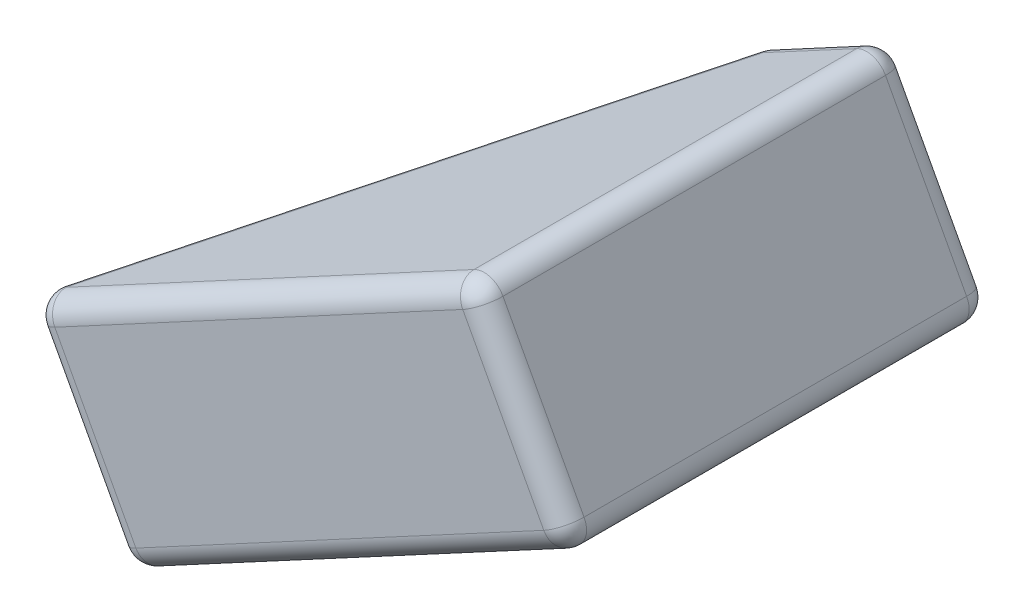
ISO-10303-21;
HEADER;
FILE_DESCRIPTION(('STEP AP214'),'2;1');
FILE_NAME('part.step','',(''),(''),'','','');
FILE_SCHEMA(('AUTOMOTIVE_DESIGN { 1 0 10303 214 1 1 1 1 }'));
ENDSEC;
DATA;
#1=APPLICATION_CONTEXT('core data for automotive mechanical design processes');
#2=APPLICATION_PROTOCOL_DEFINITION('international standard','automotive_design',2000,#1);
#3=PRODUCT_CONTEXT('',#1,'mechanical');
#4=PRODUCT('Part','Part','',(#3));
#5=PRODUCT_RELATED_PRODUCT_CATEGORY('part','',(#4));
#6=PRODUCT_DEFINITION_FORMATION('','',#4);
#7=PRODUCT_DEFINITION_CONTEXT('part definition',#1,'design');
#8=PRODUCT_DEFINITION('design','',#6,#7);
#9=PRODUCT_DEFINITION_SHAPE('','',#8);
#10=(LENGTH_UNIT() NAMED_UNIT(*) SI_UNIT(.MILLI.,.METRE.));
#11=(NAMED_UNIT(*) PLANE_ANGLE_UNIT() SI_UNIT($,.RADIAN.));
#12=(NAMED_UNIT(*) SI_UNIT($,.STERADIAN.) SOLID_ANGLE_UNIT());
#13=UNCERTAINTY_MEASURE_WITH_UNIT(LENGTH_MEASURE(1.E-05),#10,'distance_accuracy_value','');
#14=(GEOMETRIC_REPRESENTATION_CONTEXT(3) GLOBAL_UNCERTAINTY_ASSIGNED_CONTEXT((#13)) GLOBAL_UNIT_ASSIGNED_CONTEXT((#10,
#11,#12)) REPRESENTATION_CONTEXT('',''));
#15=CARTESIAN_POINT('',(0.,0.,0.));
#16=DIRECTION('',(0.,0.,1.));
#17=DIRECTION('',(1.,0.,0.));
#18=AXIS2_PLACEMENT_3D('',#15,#16,#17);
#19=CARTESIAN_POINT('',(-112.546868697293,182.325932093575,0.));
#20=DIRECTION('',(-0.88073389674916,-0.473611447409203,0.));
#21=DIRECTION('',(0.473611447409203,-0.88073389674916,0.));
#22=AXIS2_PLACEMENT_3D('',#19,#20,#21);
#23=PLANE('',#22);
#24=DIRECTION('',(0.,0.,1.));
#25=VECTOR('',#24,1.);
#26=CARTESIAN_POINT('',(-114.952814850132,186.800060289061,0.));
#27=LINE('',#26,#25);
#28=CARTESIAN_POINT('',(-114.952814850132,186.800060289061,736.2825));
#29=VERTEX_POINT('',#28);
#30=CARTESIAN_POINT('',(-114.952814850132,186.800060289061,645.455537260085));
#31=VERTEX_POINT('',#30);
#32=EDGE_CURVE('E159',#29,#31,#27,.F.);
#33=ORIENTED_EDGE('',*,*,#32,.T.);
#34=DIRECTION('',(-0.473611447409203,0.88073389674916,0.));
#35=VECTOR('',#34,1.);
#36=CARTESIAN_POINT('',(-136.60633022568,227.067214048432,645.455537260085));
#37=LINE('',#36,#35);
#38=CARTESIAN_POINT('',(-134.200384072842,222.593085852946,645.455537260085));
#39=VERTEX_POINT('',#38);
#40=EDGE_CURVE('E162',#31,#39,#37,.T.);
#41=ORIENTED_EDGE('',*,*,#40,.T.);
#42=DIRECTION('',(0.,0.,1.));
#43=VECTOR('',#42,1.);
#44=CARTESIAN_POINT('',(-134.200384072842,222.593085852946,741.3625));
#45=LINE('',#44,#43);
#46=CARTESIAN_POINT('',(-134.200384072842,222.593085852946,736.2825));
#47=VERTEX_POINT('',#46);
#48=EDGE_CURVE('E135',#39,#47,#45,.T.);
#49=ORIENTED_EDGE('',*,*,#48,.T.);
#50=DIRECTION('',(-0.473611447409203,0.88073389674916,0.));
#51=VECTOR('',#50,1.);
#52=CARTESIAN_POINT('',(-112.546868697293,182.325932093575,736.2825));
#53=LINE('',#52,#51);
#54=EDGE_CURVE('E153',#47,#29,#53,.F.);
#55=ORIENTED_EDGE('',*,*,#54,.T.);
#56=EDGE_LOOP('',(#33,#41,#49,#55));
#57=FACE_BOUND('',#56,.T.);
#58=ADVANCED_FACE('F41',(#57),#23,.F.);
#59=CARTESIAN_POINT('',(-101.297964826565,188.374989207928,741.3625));
#60=DIRECTION('',(0.,0.,-1.));
#61=DIRECTION('',(-1.,0.,0.));
#62=AXIS2_PLACEMENT_3D('',#59,#60,#61);
#63=PLANE('',#62);
#64=DIRECTION('',(-0.88073389674916,-0.473611447409203,0.));
#65=VECTOR('',#64,1.);
#66=CARTESIAN_POINT('',(-245.820166389185,162.569954169847,741.3625));
#67=LINE('',#66,#65);
#68=CARTESIAN_POINT('',(-138.674512268327,220.187139700108,741.3625));
#69=VERTEX_POINT('',#68);
#70=CARTESIAN_POINT('',(-235.529606277727,168.103665415694,741.3625));
#71=VERTEX_POINT('',#70);
#72=EDGE_CURVE('E197',#69,#71,#67,.T.);
#73=ORIENTED_EDGE('',*,*,#72,.T.);
#74=DIRECTION('',(-0.473611447409203,0.88073389674916,0.));
#75=VECTOR('',#74,1.);
#76=CARTESIAN_POINT('',(-213.876090902179,127.836511656322,741.3625));
#77=LINE('',#76,#75);
#78=CARTESIAN_POINT('',(-216.282037055017,132.310639851808,741.3625));
#79=VERTEX_POINT('',#78);
#80=EDGE_CURVE('E200',#71,#79,#77,.F.);
#81=ORIENTED_EDGE('',*,*,#80,.T.);
#82=DIRECTION('',(-0.88073389674916,-0.473611447409203,0.));
#83=VECTOR('',#82,1.);
#84=CARTESIAN_POINT('',(-103.703910979404,192.849117403414,741.3625));
#85=LINE('',#84,#83);
#86=CARTESIAN_POINT('',(-119.426943045617,184.394114136222,741.3625));
#87=VERTEX_POINT('',#86);
#88=EDGE_CURVE('E195',#79,#87,#85,.F.);
#89=ORIENTED_EDGE('',*,*,#88,.T.);
#90=DIRECTION('',(-0.473611447409203,0.88073389674916,0.));
#91=VECTOR('',#90,1.);
#92=CARTESIAN_POINT('',(-117.020996892779,179.919985940736,741.3625));
#93=LINE('',#92,#91);
#94=EDGE_CURVE('E193',#87,#69,#93,.T.);
#95=ORIENTED_EDGE('',*,*,#94,.T.);
#96=EDGE_LOOP('',(#73,#81,#89,#95));
#97=FACE_BOUND('',#96,.T.);
#98=ADVANCED_FACE('F330',(#97),#63,.F.);
#99=CARTESIAN_POINT('',(158.667717373974,328.170588625835,275.280094349453));
#100=DIRECTION('',(-0.644095135315765,-0.34635981473188,-0.682038367983403));
#101=DIRECTION('',(-0.727040935214636,0.,0.686594114832211));
#102=AXIS2_PLACEMENT_3D('',#99,#100,#101);
#103=PLANE('',#102);
#104=DIRECTION('',(-0.60069430956646,-0.323021178649231,0.73131639158338));
#105=VECTOR('',#104,1.);
#106=CARTESIAN_POINT('',(137.014201998425,368.437742385207,275.280094349453));
#107=LINE('',#106,#105);
#108=CARTESIAN_POINT('',(-238.801609565132,166.344157556856,732.817745090644));
#109=VERTEX_POINT('',#108);
#110=CARTESIAN_POINT('',(-164.197456969912,206.462269081547,641.99078235073));
#111=VERTEX_POINT('',#110);
#112=EDGE_CURVE('E188',#109,#111,#107,.F.);
#113=ORIENTED_EDGE('',*,*,#112,.T.);
#114=DIRECTION('',(-0.473611447409203,0.88073389674916,0.));
#115=VECTOR('',#114,1.);
#116=CARTESIAN_POINT('',(-142.543941594364,166.195115322176,641.99078235073));
#117=LINE('',#116,#115);
#118=CARTESIAN_POINT('',(-144.949887747202,170.669243517661,641.99078235073));
#119=VERTEX_POINT('',#118);
#120=EDGE_CURVE('E191',#111,#119,#117,.F.);
#121=ORIENTED_EDGE('',*,*,#120,.T.);
#122=DIRECTION('',(-0.60069430956646,-0.323021178649231,0.73131639158338));
#123=VECTOR('',#122,1.);
#124=CARTESIAN_POINT('',(-226.572597166475,126.776928605961,741.3625));
#125=LINE('',#124,#123);
#126=CARTESIAN_POINT('',(-219.554040342421,130.55113199297,732.817745090644));
#127=VERTEX_POINT('',#126);
#128=EDGE_CURVE('E186',#119,#127,#125,.T.);
#129=ORIENTED_EDGE('',*,*,#128,.T.);
#130=DIRECTION('',(-0.473611447409203,0.88073389674916,0.));
#131=VECTOR('',#130,1.);
#132=CARTESIAN_POINT('',(-241.20755571797,170.818285752342,732.817745090644));
#133=LINE('',#132,#131);
#134=EDGE_CURVE('E184',#127,#109,#133,.T.);
#135=ORIENTED_EDGE('',*,*,#134,.T.);
#136=EDGE_LOOP('',(#113,#121,#129,#135));
#137=FACE_BOUND('',#136,.T.);
#138=ADVANCED_FACE('F301',(#137),#103,.T.);
#139=CARTESIAN_POINT('',(-101.297964826565,188.374989207928,640.375537260085));
#140=DIRECTION('',(0.,0.,-1.));
#141=DIRECTION('',(-1.,0.,0.));
#142=AXIS2_PLACEMENT_3D('',#139,#140,#141);
#143=PLANE('',#142);
#144=DIRECTION('',(-0.88073389674916,-0.473611447409203,0.));
#145=VECTOR('',#144,1.);
#146=CARTESIAN_POINT('',(-122.951480202114,228.642142967299,640.375537260085));
#147=LINE('',#146,#145);
#148=CARTESIAN_POINT('',(-160.925453682508,208.221776940385,640.375537260085));
#149=VERTEX_POINT('',#148);
#150=CARTESIAN_POINT('',(-138.674512268327,220.187139700108,640.375537260085));
#151=VERTEX_POINT('',#150);
#152=EDGE_CURVE('E179',#149,#151,#147,.F.);
#153=ORIENTED_EDGE('',*,*,#152,.T.);
#154=DIRECTION('',(-0.473611447409203,0.88073389674916,0.));
#155=VECTOR('',#154,1.);
#156=CARTESIAN_POINT('',(-117.020996892779,179.919985940736,640.375537260085));
#157=LINE('',#156,#155);
#158=CARTESIAN_POINT('',(-119.426943045617,184.394114136222,640.375537260085));
#159=VERTEX_POINT('',#158);
#160=EDGE_CURVE('E182',#151,#159,#157,.F.);
#161=ORIENTED_EDGE('',*,*,#160,.T.);
#162=DIRECTION('',(-0.88073389674916,-0.473611447409203,0.));
#163=VECTOR('',#162,1.);
#164=CARTESIAN_POINT('',(-143.623145251517,171.382694465831,640.375537260085));
#165=LINE('',#164,#163);
#166=CARTESIAN_POINT('',(-141.677884459798,172.428751376499,640.375537260085));
#167=VERTEX_POINT('',#166);
#168=EDGE_CURVE('E177',#159,#167,#165,.T.);
#169=ORIENTED_EDGE('',*,*,#168,.T.);
#170=DIRECTION('',(-0.473611447409203,0.88073389674916,0.));
#171=VECTOR('',#170,1.);
#172=CARTESIAN_POINT('',(-139.271938306959,167.954623181014,640.375537260085));
#173=LINE('',#172,#171);
#174=EDGE_CURVE('E175',#167,#149,#173,.T.);
#175=ORIENTED_EDGE('',*,*,#174,.T.);
#176=EDGE_LOOP('',(#153,#161,#169,#175));
#177=FACE_BOUND('',#176,.T.);
#178=ADVANCED_FACE('F274',(#177),#143,.T.);
#179=CARTESIAN_POINT('',(-101.297964826565,188.374989207928,0.));
#180=DIRECTION('',(-0.473611447409203,0.88073389674916,0.));
#181=DIRECTION('',(-0.88073389674916,-0.473611447409203,0.));
#182=AXIS2_PLACEMENT_3D('',#179,#180,#181);
#183=PLANE('',#182);
#184=DIRECTION('',(-0.88073389674916,-0.473611447409203,0.));
#185=VECTOR('',#184,1.);
#186=CARTESIAN_POINT('',(-112.546868697293,182.325932093575,645.455537260085));
#187=LINE('',#186,#185);
#188=CARTESIAN_POINT('',(-139.271938306959,167.954623181014,645.455537260085));
#189=VERTEX_POINT('',#188);
#190=CARTESIAN_POINT('',(-117.020996892779,179.919985940736,645.455537260085));
#191=VERTEX_POINT('',#190);
#192=EDGE_CURVE('E50',#189,#191,#187,.F.);
#193=ORIENTED_EDGE('',*,*,#192,.T.);
#194=DIRECTION('',(0.,0.,1.));
#195=VECTOR('',#194,1.);
#196=CARTESIAN_POINT('',(-117.020996892779,179.919985940736,0.));
#197=LINE('',#196,#195);
#198=CARTESIAN_POINT('',(-117.020996892779,179.919985940736,736.2825));
#199=VERTEX_POINT('',#198);
#200=EDGE_CURVE('E11',#191,#199,#197,.T.);
#201=ORIENTED_EDGE('',*,*,#200,.T.);
#202=DIRECTION('',(-0.88073389674916,-0.473611447409203,0.));
#203=VECTOR('',#202,1.);
#204=CARTESIAN_POINT('',(-101.297964826565,188.374989207928,736.2825));
#205=LINE('',#204,#203);
#206=CARTESIAN_POINT('',(-213.876090902179,127.836511656322,736.2825));
#207=VERTEX_POINT('',#206);
#208=EDGE_CURVE('E202',#199,#207,#205,.T.);
#209=ORIENTED_EDGE('',*,*,#208,.T.);
#210=DIRECTION('',(-0.60069430956646,-0.323021178649231,0.73131639158338));
#211=VECTOR('',#210,1.);
#212=CARTESIAN_POINT('',(-137.945195811274,168.668074129184,643.840292169441));
#213=LINE('',#212,#211);
#214=EDGE_CURVE('E61',#207,#189,#213,.F.);
#215=ORIENTED_EDGE('',*,*,#214,.T.);
#216=EDGE_LOOP('',(#193,#201,#209,#215));
#217=FACE_BOUND('',#216,.T.);
#218=ADVANCED_FACE('F289',(#217),#183,.F.);
#219=CARTESIAN_POINT('',(-125.357426354952,233.116271162785,0.));
#220=DIRECTION('',(-0.473611447409203,0.88073389674916,0.));
#221=DIRECTION('',(-0.88073389674916,-0.473611447409203,0.));
#222=AXIS2_PLACEMENT_3D('',#219,#220,#221);
#223=PLANE('',#222);
#224=DIRECTION('',(-0.88073389674916,-0.473611447409203,0.));
#225=VECTOR('',#224,1.);
#226=CARTESIAN_POINT('',(-136.60633022568,227.067214048432,736.2825));
#227=LINE('',#226,#225);
#228=CARTESIAN_POINT('',(-237.935552430566,172.57779361118,736.2825));
#229=VERTEX_POINT('',#228);
#230=CARTESIAN_POINT('',(-141.080458421166,224.661267895593,736.2825));
#231=VERTEX_POINT('',#230);
#232=EDGE_CURVE('E165',#229,#231,#227,.F.);
#233=ORIENTED_EDGE('',*,*,#232,.T.);
#234=DIRECTION('',(0.,0.,1.));
#235=VECTOR('',#234,1.);
#236=CARTESIAN_POINT('',(-141.080458421166,224.661267895593,640.375537260085));
#237=LINE('',#236,#235);
#238=CARTESIAN_POINT('',(-141.080458421166,224.661267895593,645.455537260085));
#239=VERTEX_POINT('',#238);
#240=EDGE_CURVE('E137',#231,#239,#237,.F.);
#241=ORIENTED_EDGE('',*,*,#240,.T.);
#242=DIRECTION('',(-0.88073389674916,-0.473611447409203,0.));
#243=VECTOR('',#242,1.);
#244=CARTESIAN_POINT('',(-125.357426354952,233.116271162785,645.455537260085));
#245=LINE('',#244,#243);
#246=CARTESIAN_POINT('',(-163.331399835347,212.695905135871,645.455537260085));
#247=VERTEX_POINT('',#246);
#248=EDGE_CURVE('E172',#239,#247,#245,.T.);
#249=ORIENTED_EDGE('',*,*,#248,.T.);
#250=DIRECTION('',(-0.60069430956646,-0.323021178649231,0.73131639158338));
#251=VECTOR('',#250,1.);
#252=CARTESIAN_POINT('',(137.880259132991,374.671378439531,278.744849258809));
#253=LINE('',#252,#251);
#254=EDGE_CURVE('E170',#247,#229,#253,.T.);
#255=ORIENTED_EDGE('',*,*,#254,.T.);
#256=EDGE_LOOP('',(#233,#241,#249,#255));
#257=FACE_BOUND('',#256,.T.);
#258=ADVANCED_FACE('F492',(#257),#223,.T.);
#259=CARTESIAN_POINT('',(159.533774508539,334.404224680159,278.744849258809));
#260=DIRECTION('',(0.60069430956646,0.323021178649231,-0.73131639158338));
#261=DIRECTION('',(-0.772741734414245,0.,-0.634720577809216));
#262=AXIS2_PLACEMENT_3D('',#259,#260,#261);
#263=CYLINDRICAL_SURFACE('',#262,5.08);
#264=CARTESIAN_POINT('',(-141.677884459798,172.428751376499,645.455537260085));
#265=DIRECTION('',(0.600694309566454,0.323021178649229,-0.731316391583386));
#266=DIRECTION('',(-0.77274173441425,0.,-0.634720577809209));
#267=AXIS2_PLACEMENT_3D('',#264,#265,#266);
#268=CIRCLE('',#267,5.08);
#269=EDGE_CURVE('E45',#189,#119,#268,.T.);
#270=ORIENTED_EDGE('',*,*,#269,.F.);
#271=ORIENTED_EDGE('',*,*,#214,.F.);
#272=CARTESIAN_POINT('',(-216.282037055017,132.310639851808,736.2825));
#273=DIRECTION('',(-0.600694309566459,-0.323021178649236,0.731316391583379));
#274=DIRECTION('',(0.772741734414245,0.,0.634720577809215));
#275=AXIS2_PLACEMENT_3D('',#272,#273,#274);
#276=CIRCLE('',#275,5.08);
#277=EDGE_CURVE('E254',#127,#207,#276,.T.);
#278=ORIENTED_EDGE('',*,*,#277,.F.);
#279=ORIENTED_EDGE('',*,*,#128,.F.);
#280=EDGE_LOOP('',(#270,#271,#278,#279));
#281=FACE_BOUND('',#280,.T.);
#282=ADVANCED_FACE('F43',(#281),#263,.T.);
#283=CARTESIAN_POINT('',(-141.677884459798,172.428751376499,645.455537260085));
#284=DIRECTION('',(0.473611447409218,-0.880733896749152,0.));
#285=DIRECTION('',(0.880733896749152,0.473611447409218,0.));
#286=AXIS2_PLACEMENT_3D('',#283,#284,#285);
#287=SPHERICAL_SURFACE('',#286,5.08);
#288=CARTESIAN_POINT('',(-141.677884459798,172.428751376499,645.455537260085));
#289=DIRECTION('',(-0.88073389674915,-0.473611447409222,0.));
#290=DIRECTION('',(0.473611447409222,-0.88073389674915,0.));
#291=AXIS2_PLACEMENT_3D('',#288,#289,#290);
#292=CIRCLE('',#291,5.08);
#293=EDGE_CURVE('E249',#189,#167,#292,.F.);
#294=ORIENTED_EDGE('',*,*,#293,.F.);
#295=ORIENTED_EDGE('',*,*,#269,.T.);
#296=CARTESIAN_POINT('',(-141.677884459798,172.428751376499,645.455537260085));
#297=DIRECTION('',(0.473611447409199,-0.880733896749162,0.));
#298=DIRECTION('',(0.880733896749162,0.473611447409199,0.));
#299=AXIS2_PLACEMENT_3D('',#296,#297,#298);
#300=CIRCLE('',#299,5.08);
#301=EDGE_CURVE('E252',#167,#119,#300,.F.);
#302=ORIENTED_EDGE('',*,*,#301,.F.);
#303=EDGE_LOOP('',(#294,#295,#302));
#304=FACE_BOUND('',#303,.T.);
#305=ADVANCED_FACE('F264',(#304),#287,.T.);
#306=CARTESIAN_POINT('',(-216.282037055017,132.310639851808,736.2825));
#307=DIRECTION('',(0.473611447409232,-0.880733896749144,0.));
#308=DIRECTION('',(0.880733896749144,0.473611447409233,0.));
#309=AXIS2_PLACEMENT_3D('',#306,#307,#308);
#310=SPHERICAL_SURFACE('',#309,5.08);
#311=CARTESIAN_POINT('',(-216.282037055017,132.310639851808,736.2825));
#312=DIRECTION('',(0.473611447409185,-0.88073389674917,0.));
#313=DIRECTION('',(0.88073389674917,0.473611447409185,0.));
#314=AXIS2_PLACEMENT_3D('',#311,#312,#313);
#315=CIRCLE('',#314,5.08);
#316=EDGE_CURVE('E243',#127,#79,#315,.F.);
#317=ORIENTED_EDGE('',*,*,#316,.F.);
#318=ORIENTED_EDGE('',*,*,#277,.T.);
#319=CARTESIAN_POINT('',(-216.282037055017,132.310639851808,736.2825));
#320=DIRECTION('',(-0.880733896749159,-0.473611447409205,0.));
#321=DIRECTION('',(0.473611447409205,-0.880733896749159,0.));
#322=AXIS2_PLACEMENT_3D('',#319,#320,#321);
#323=CIRCLE('',#322,5.08);
#324=EDGE_CURVE('E246',#79,#207,#323,.F.);
#325=ORIENTED_EDGE('',*,*,#324,.F.);
#326=EDGE_LOOP('',(#317,#318,#325));
#327=FACE_BOUND('',#326,.T.);
#328=ADVANCED_FACE('F293',(#327),#310,.T.);
#329=CARTESIAN_POINT('',(-139.271938306959,167.954623181014,645.455537260085));
#330=DIRECTION('',(-0.473611447409203,0.88073389674916,0.));
#331=DIRECTION('',(-0.88073389674916,-0.473611447409203,0.));
#332=AXIS2_PLACEMENT_3D('',#329,#330,#331);
#333=CYLINDRICAL_SURFACE('',#332,5.08);
#334=ORIENTED_EDGE('',*,*,#301,.T.);
#335=ORIENTED_EDGE('',*,*,#120,.F.);
#336=CARTESIAN_POINT('',(-160.925453682508,208.221776940385,645.455537260085));
#337=DIRECTION('',(-0.473611447409196,0.880733896749164,0.));
#338=DIRECTION('',(-0.880733896749164,-0.473611447409196,0.));
#339=AXIS2_PLACEMENT_3D('',#336,#337,#338);
#340=CIRCLE('',#339,5.08);
#341=EDGE_CURVE('E238',#149,#111,#340,.T.);
#342=ORIENTED_EDGE('',*,*,#341,.F.);
#343=ORIENTED_EDGE('',*,*,#174,.F.);
#344=EDGE_LOOP('',(#334,#335,#342,#343));
#345=FACE_BOUND('',#344,.T.);
#346=ADVANCED_FACE('F270',(#345),#333,.T.);
#347=CARTESIAN_POINT('',(-103.703910979404,192.849117403414,645.455537260085));
#348=DIRECTION('',(0.88073389674916,0.473611447409203,0.));
#349=DIRECTION('',(-0.473611447409203,0.88073389674916,0.));
#350=AXIS2_PLACEMENT_3D('',#347,#348,#349);
#351=CYLINDRICAL_SURFACE('',#350,5.08);
#352=ORIENTED_EDGE('',*,*,#293,.T.);
#353=ORIENTED_EDGE('',*,*,#168,.F.);
#354=CARTESIAN_POINT('',(-119.426943045617,184.394114136222,645.455537260085));
#355=DIRECTION('',(0.88073389674916,0.473611447409202,0.));
#356=DIRECTION('',(-0.473611447409202,0.88073389674916,0.));
#357=AXIS2_PLACEMENT_3D('',#354,#355,#356);
#358=CIRCLE('',#357,5.08);
#359=EDGE_CURVE('E235',#191,#159,#358,.T.);
#360=ORIENTED_EDGE('',*,*,#359,.F.);
#361=ORIENTED_EDGE('',*,*,#192,.F.);
#362=EDGE_LOOP('',(#352,#353,#360,#361));
#363=FACE_BOUND('',#362,.T.);
#364=ADVANCED_FACE('F280',(#363),#351,.T.);
#365=CARTESIAN_POINT('',(-119.426943045617,184.394114136222,0.));
#366=DIRECTION('',(0.,0.,1.));
#367=DIRECTION('',(0.,-1.,0.));
#368=AXIS2_PLACEMENT_3D('',#365,#366,#367);
#369=CYLINDRICAL_SURFACE('',#368,5.08);
#370=CARTESIAN_POINT('',(-119.426943045617,184.394114136222,736.2825));
#371=DIRECTION('',(0.,0.,1.));
#372=DIRECTION('',(1.,0.,0.));
#373=AXIS2_PLACEMENT_3D('',#370,#371,#372);
#374=CIRCLE('',#373,5.08);
#375=EDGE_CURVE('E229',#199,#29,#374,.T.);
#376=ORIENTED_EDGE('',*,*,#375,.F.);
#377=ORIENTED_EDGE('',*,*,#200,.F.);
#378=CARTESIAN_POINT('',(-119.426943045617,184.394114136222,645.455537260085));
#379=DIRECTION('',(0.,0.,-1.));
#380=DIRECTION('',(-1.,0.,0.));
#381=AXIS2_PLACEMENT_3D('',#378,#379,#380);
#382=CIRCLE('',#381,5.08);
#383=EDGE_CURVE('E232',#31,#191,#382,.T.);
#384=ORIENTED_EDGE('',*,*,#383,.F.);
#385=ORIENTED_EDGE('',*,*,#32,.F.);
#386=EDGE_LOOP('',(#376,#377,#384,#385));
#387=FACE_BOUND('',#386,.T.);
#388=ADVANCED_FACE('F287',(#387),#369,.T.);
#389=CARTESIAN_POINT('',(-103.703910979404,192.849117403414,736.2825));
#390=DIRECTION('',(-0.88073389674916,-0.473611447409203,0.));
#391=DIRECTION('',(0.473611447409203,-0.88073389674916,0.));
#392=AXIS2_PLACEMENT_3D('',#389,#390,#391);
#393=CYLINDRICAL_SURFACE('',#392,5.08);
#394=ORIENTED_EDGE('',*,*,#324,.T.);
#395=ORIENTED_EDGE('',*,*,#208,.F.);
#396=CARTESIAN_POINT('',(-119.426943045617,184.394114136222,736.2825));
#397=DIRECTION('',(0.880733896749161,0.4736114474092,0.));
#398=DIRECTION('',(-0.4736114474092,0.880733896749161,0.));
#399=AXIS2_PLACEMENT_3D('',#396,#397,#398);
#400=CIRCLE('',#399,5.08);
#401=EDGE_CURVE('E227',#87,#199,#400,.T.);
#402=ORIENTED_EDGE('',*,*,#401,.F.);
#403=ORIENTED_EDGE('',*,*,#88,.F.);
#404=EDGE_LOOP('',(#394,#395,#402,#403));
#405=FACE_BOUND('',#404,.T.);
#406=ADVANCED_FACE('F436',(#405),#393,.T.);
#407=CARTESIAN_POINT('',(-213.876090902179,127.836511656322,736.2825));
#408=DIRECTION('',(0.473611447409203,-0.88073389674916,0.));
#409=DIRECTION('',(0.88073389674916,0.473611447409203,0.));
#410=AXIS2_PLACEMENT_3D('',#407,#408,#409);
#411=CYLINDRICAL_SURFACE('',#410,5.08);
#412=ORIENTED_EDGE('',*,*,#316,.T.);
#413=ORIENTED_EDGE('',*,*,#80,.F.);
#414=CARTESIAN_POINT('',(-235.529606277727,168.103665415694,736.2825));
#415=DIRECTION('',(-0.473611447409219,0.880733896749151,0.));
#416=DIRECTION('',(-0.880733896749151,-0.473611447409219,0.));
#417=AXIS2_PLACEMENT_3D('',#414,#415,#416);
#418=CIRCLE('',#417,5.08);
#419=EDGE_CURVE('E224',#109,#71,#418,.T.);
#420=ORIENTED_EDGE('',*,*,#419,.F.);
#421=ORIENTED_EDGE('',*,*,#134,.F.);
#422=EDGE_LOOP('',(#412,#413,#420,#421));
#423=FACE_BOUND('',#422,.T.);
#424=ADVANCED_FACE('F298',(#423),#411,.T.);
#425=CARTESIAN_POINT('',(140.286205285829,370.197250244045,278.744849258809));
#426=DIRECTION('',(-0.60069430956646,-0.323021178649231,0.73131639158338));
#427=DIRECTION('',(0.772741734414245,0.,0.634720577809216));
#428=AXIS2_PLACEMENT_3D('',#425,#426,#427);
#429=CYLINDRICAL_SURFACE('',#428,5.08);
#430=CARTESIAN_POINT('',(-160.925453682508,208.221776940385,645.455537260085));
#431=DIRECTION('',(0.600694309566468,0.323021178649219,-0.731316391583379));
#432=DIRECTION('',(-0.77274173441424,0.,-0.634720577809221));
#433=AXIS2_PLACEMENT_3D('',#430,#431,#432);
#434=CIRCLE('',#433,5.08);
#435=EDGE_CURVE('E240',#111,#247,#434,.T.);
#436=ORIENTED_EDGE('',*,*,#435,.F.);
#437=ORIENTED_EDGE('',*,*,#112,.F.);
#438=CARTESIAN_POINT('',(-235.529606277727,168.103665415694,736.2825));
#439=DIRECTION('',(-0.600694309566456,-0.323021178649229,0.731316391583384));
#440=DIRECTION('',(0.772741734414249,0.,0.634720577809211));
#441=AXIS2_PLACEMENT_3D('',#438,#439,#440);
#442=CIRCLE('',#441,5.08);
#443=EDGE_CURVE('E221',#229,#109,#442,.T.);
#444=ORIENTED_EDGE('',*,*,#443,.F.);
#445=ORIENTED_EDGE('',*,*,#254,.F.);
#446=EDGE_LOOP('',(#436,#437,#444,#445));
#447=FACE_BOUND('',#446,.T.);
#448=ADVANCED_FACE('F305',(#447),#429,.T.);
#449=CARTESIAN_POINT('',(-160.925453682508,208.221776940385,645.455537260085));
#450=DIRECTION('',(-0.473611447409194,0.880733896749165,0.));
#451=DIRECTION('',(-0.880733896749165,-0.473611447409194,0.));
#452=AXIS2_PLACEMENT_3D('',#449,#450,#451);
#453=SPHERICAL_SURFACE('',#452,5.08);
#454=ORIENTED_EDGE('',*,*,#341,.T.);
#455=ORIENTED_EDGE('',*,*,#435,.T.);
#456=CARTESIAN_POINT('',(-160.925453682508,208.221776940385,645.455537260085));
#457=DIRECTION('',(-0.880733896749159,-0.473611447409205,0.));
#458=DIRECTION('',(0.473611447409205,-0.880733896749159,0.));
#459=AXIS2_PLACEMENT_3D('',#456,#457,#458);
#460=CIRCLE('',#459,5.08);
#461=EDGE_CURVE('E218',#149,#247,#460,.F.);
#462=ORIENTED_EDGE('',*,*,#461,.F.);
#463=EDGE_LOOP('',(#454,#455,#462));
#464=FACE_BOUND('',#463,.T.);
#465=ADVANCED_FACE('F309',(#464),#453,.T.);
#466=CARTESIAN_POINT('',(-119.426943045617,184.394114136222,645.455537260085));
#467=DIRECTION('',(0.473611447409198,-0.880733896749162,0.));
#468=DIRECTION('',(0.880733896749163,0.473611447409198,0.));
#469=AXIS2_PLACEMENT_3D('',#466,#467,#468);
#470=SPHERICAL_SURFACE('',#469,5.08);
#471=ORIENTED_EDGE('',*,*,#383,.T.);
#472=ORIENTED_EDGE('',*,*,#359,.T.);
#473=CARTESIAN_POINT('',(-119.426943045617,184.394114136222,645.455537260085));
#474=DIRECTION('',(0.473611447409199,-0.880733896749162,0.));
#475=DIRECTION('',(0.880733896749162,0.473611447409199,0.));
#476=AXIS2_PLACEMENT_3D('',#473,#474,#475);
#477=CIRCLE('',#476,5.08);
#478=EDGE_CURVE('E215',#31,#159,#477,.F.);
#479=ORIENTED_EDGE('',*,*,#478,.F.);
#480=EDGE_LOOP('',(#471,#472,#479));
#481=FACE_BOUND('',#480,.T.);
#482=ADVANCED_FACE('F284',(#481),#470,.T.);
#483=CARTESIAN_POINT('',(-119.426943045617,184.394114136222,736.2825));
#484=DIRECTION('',(0.4736114474092,-0.880733896749161,0.));
#485=DIRECTION('',(0.880733896749161,0.4736114474092,0.));
#486=AXIS2_PLACEMENT_3D('',#483,#484,#485);
#487=SPHERICAL_SURFACE('',#486,5.08);
#488=ORIENTED_EDGE('',*,*,#401,.T.);
#489=ORIENTED_EDGE('',*,*,#375,.T.);
#490=CARTESIAN_POINT('',(-119.426943045617,184.394114136222,736.2825));
#491=DIRECTION('',(0.473611447409205,-0.880733896749159,0.));
#492=DIRECTION('',(0.880733896749159,0.473611447409205,0.));
#493=AXIS2_PLACEMENT_3D('',#490,#491,#492);
#494=CIRCLE('',#493,5.08);
#495=EDGE_CURVE('E156',#87,#29,#494,.F.);
#496=ORIENTED_EDGE('',*,*,#495,.F.);
#497=EDGE_LOOP('',(#488,#489,#496));
#498=FACE_BOUND('',#497,.T.);
#499=ADVANCED_FACE('F393',(#498),#487,.T.);
#500=CARTESIAN_POINT('',(-235.529606277727,168.103665415694,736.2825));
#501=DIRECTION('',(-0.473611447409176,0.880733896749174,0.));
#502=DIRECTION('',(-0.880733896749174,-0.473611447409177,0.));
#503=AXIS2_PLACEMENT_3D('',#500,#501,#502);
#504=SPHERICAL_SURFACE('',#503,5.08);
#505=ORIENTED_EDGE('',*,*,#443,.T.);
#506=ORIENTED_EDGE('',*,*,#419,.T.);
#507=CARTESIAN_POINT('',(-235.529606277727,168.103665415694,736.2825));
#508=DIRECTION('',(-0.880733896749166,-0.473611447409191,0.));
#509=DIRECTION('',(0.473611447409191,-0.880733896749166,0.));
#510=AXIS2_PLACEMENT_3D('',#507,#508,#509);
#511=CIRCLE('',#510,5.08);
#512=EDGE_CURVE('E212',#229,#71,#511,.F.);
#513=ORIENTED_EDGE('',*,*,#512,.F.);
#514=EDGE_LOOP('',(#505,#506,#513));
#515=FACE_BOUND('',#514,.T.);
#516=ADVANCED_FACE('F384',(#515),#504,.T.);
#517=CARTESIAN_POINT('',(-122.951480202114,228.642142967299,645.455537260085));
#518=DIRECTION('',(-0.88073389674916,-0.473611447409203,0.));
#519=DIRECTION('',(0.473611447409203,-0.88073389674916,0.));
#520=AXIS2_PLACEMENT_3D('',#517,#518,#519);
#521=CYLINDRICAL_SURFACE('',#520,5.08);
#522=ORIENTED_EDGE('',*,*,#461,.T.);
#523=ORIENTED_EDGE('',*,*,#248,.F.);
#524=CARTESIAN_POINT('',(-138.674512268327,220.187139700108,645.455537260085));
#525=DIRECTION('',(0.88073389674916,0.473611447409202,0.));
#526=DIRECTION('',(-0.473611447409202,0.88073389674916,0.));
#527=AXIS2_PLACEMENT_3D('',#524,#525,#526);
#528=CIRCLE('',#527,5.08);
#529=EDGE_CURVE('E209',#151,#239,#528,.T.);
#530=ORIENTED_EDGE('',*,*,#529,.F.);
#531=ORIENTED_EDGE('',*,*,#152,.F.);
#532=EDGE_LOOP('',(#522,#523,#530,#531));
#533=FACE_BOUND('',#532,.T.);
#534=ADVANCED_FACE('F312',(#533),#521,.T.);
#535=CARTESIAN_POINT('',(-117.020996892779,179.919985940736,645.455537260085));
#536=DIRECTION('',(0.473611447409203,-0.88073389674916,0.));
#537=DIRECTION('',(0.88073389674916,0.473611447409203,0.));
#538=AXIS2_PLACEMENT_3D('',#535,#536,#537);
#539=CYLINDRICAL_SURFACE('',#538,5.08);
#540=ORIENTED_EDGE('',*,*,#478,.T.);
#541=ORIENTED_EDGE('',*,*,#160,.F.);
#542=CARTESIAN_POINT('',(-138.674512268327,220.187139700108,645.455537260085));
#543=DIRECTION('',(-0.473611447409205,0.880733896749159,0.));
#544=DIRECTION('',(-0.880733896749159,-0.473611447409205,0.));
#545=AXIS2_PLACEMENT_3D('',#542,#543,#544);
#546=CIRCLE('',#545,5.08);
#547=EDGE_CURVE('E150',#39,#151,#546,.T.);
#548=ORIENTED_EDGE('',*,*,#547,.F.);
#549=ORIENTED_EDGE('',*,*,#40,.F.);
#550=EDGE_LOOP('',(#540,#541,#548,#549));
#551=FACE_BOUND('',#550,.T.);
#552=ADVANCED_FACE('F317',(#551),#539,.T.);
#553=CARTESIAN_POINT('',(-117.020996892779,179.919985940736,736.2825));
#554=DIRECTION('',(-0.473611447409203,0.88073389674916,0.));
#555=DIRECTION('',(-0.88073389674916,-0.473611447409203,0.));
#556=AXIS2_PLACEMENT_3D('',#553,#554,#555);
#557=CYLINDRICAL_SURFACE('',#556,5.08);
#558=ORIENTED_EDGE('',*,*,#495,.T.);
#559=ORIENTED_EDGE('',*,*,#54,.F.);
#560=CARTESIAN_POINT('',(-138.674512268327,220.187139700108,736.2825));
#561=DIRECTION('',(-0.473611447409207,0.880733896749158,0.));
#562=DIRECTION('',(-0.880733896749158,-0.473611447409207,0.));
#563=AXIS2_PLACEMENT_3D('',#560,#561,#562);
#564=CIRCLE('',#563,5.08);
#565=EDGE_CURVE('E143',#69,#47,#564,.T.);
#566=ORIENTED_EDGE('',*,*,#565,.F.);
#567=ORIENTED_EDGE('',*,*,#94,.F.);
#568=EDGE_LOOP('',(#558,#559,#566,#567));
#569=FACE_BOUND('',#568,.T.);
#570=ADVANCED_FACE('F154',(#569),#557,.T.);
#571=CARTESIAN_POINT('',(-122.951480202114,228.642142967299,736.2825));
#572=DIRECTION('',(0.88073389674916,0.473611447409203,0.));
#573=DIRECTION('',(-0.473611447409203,0.88073389674916,0.));
#574=AXIS2_PLACEMENT_3D('',#571,#572,#573);
#575=CYLINDRICAL_SURFACE('',#574,5.08);
#576=ORIENTED_EDGE('',*,*,#512,.T.);
#577=ORIENTED_EDGE('',*,*,#72,.F.);
#578=CARTESIAN_POINT('',(-138.674512268327,220.187139700108,736.2825));
#579=DIRECTION('',(0.880733896749159,0.473611447409205,0.));
#580=DIRECTION('',(-0.473611447409205,0.880733896749159,0.));
#581=AXIS2_PLACEMENT_3D('',#578,#579,#580);
#582=CIRCLE('',#581,5.08);
#583=EDGE_CURVE('E147',#231,#69,#582,.T.);
#584=ORIENTED_EDGE('',*,*,#583,.F.);
#585=ORIENTED_EDGE('',*,*,#232,.F.);
#586=EDGE_LOOP('',(#576,#577,#584,#585));
#587=FACE_BOUND('',#586,.T.);
#588=ADVANCED_FACE('F320',(#587),#575,.T.);
#589=CARTESIAN_POINT('',(-138.674512268327,220.187139700108,645.455537260085));
#590=DIRECTION('',(0.,0.,-1.));
#591=DIRECTION('',(0.,1.,0.));
#592=AXIS2_PLACEMENT_3D('',#589,#590,#591);
#593=SPHERICAL_SURFACE('',#592,5.08);
#594=ORIENTED_EDGE('',*,*,#547,.T.);
#595=ORIENTED_EDGE('',*,*,#529,.T.);
#596=CARTESIAN_POINT('',(-138.674512268327,220.187139700108,645.455537260085));
#597=DIRECTION('',(0.,0.,-1.));
#598=DIRECTION('',(-1.,0.,0.));
#599=AXIS2_PLACEMENT_3D('',#596,#597,#598);
#600=CIRCLE('',#599,5.08);
#601=EDGE_CURVE('E140',#39,#239,#600,.F.);
#602=ORIENTED_EDGE('',*,*,#601,.F.);
#603=EDGE_LOOP('',(#594,#595,#602));
#604=FACE_BOUND('',#603,.T.);
#605=ADVANCED_FACE('F318',(#604),#593,.T.);
#606=CARTESIAN_POINT('',(-138.674512268327,220.187139700108,736.2825));
#607=DIRECTION('',(0.,0.,1.));
#608=DIRECTION('',(1.,0.,0.));
#609=AXIS2_PLACEMENT_3D('',#606,#607,#608);
#610=SPHERICAL_SURFACE('',#609,5.08);
#611=ORIENTED_EDGE('',*,*,#583,.T.);
#612=ORIENTED_EDGE('',*,*,#565,.T.);
#613=CARTESIAN_POINT('',(-138.674512268327,220.187139700108,736.2825));
#614=DIRECTION('',(0.,0.,1.));
#615=DIRECTION('',(1.,0.,0.));
#616=AXIS2_PLACEMENT_3D('',#613,#614,#615);
#617=CIRCLE('',#616,5.08);
#618=EDGE_CURVE('E131',#231,#47,#617,.F.);
#619=ORIENTED_EDGE('',*,*,#618,.F.);
#620=EDGE_LOOP('',(#611,#612,#619));
#621=FACE_BOUND('',#620,.T.);
#622=ADVANCED_FACE('F145',(#621),#610,.T.);
#623=CARTESIAN_POINT('',(-138.674512268327,220.187139700108,0.));
#624=DIRECTION('',(0.,0.,-1.));
#625=DIRECTION('',(0.,1.,0.));
#626=AXIS2_PLACEMENT_3D('',#623,#624,#625);
#627=CYLINDRICAL_SURFACE('',#626,5.08);
#628=ORIENTED_EDGE('',*,*,#601,.T.);
#629=ORIENTED_EDGE('',*,*,#240,.F.);
#630=ORIENTED_EDGE('',*,*,#618,.T.);
#631=ORIENTED_EDGE('',*,*,#48,.F.);
#632=EDGE_LOOP('',(#628,#629,#630,#631));
#633=FACE_BOUND('',#632,.T.);
#634=ADVANCED_FACE('F133',(#633),#627,.T.);
#635=CLOSED_SHELL('',(#58,#98,#138,#178,#218,#258,#282,#305,#328,#346,#364,#388,#406,#424,#448,
#465,#482,#499,#516,#534,#552,#570,#588,#605,#622,#634));
#636=MANIFOLD_SOLID_BREP('B2',#635);
#637=ADVANCED_BREP_SHAPE_REPRESENTATION('',(#18,#636),#14);
#638=SHAPE_DEFINITION_REPRESENTATION(#9,#637);
ENDSEC;
END-ISO-10303-21;
